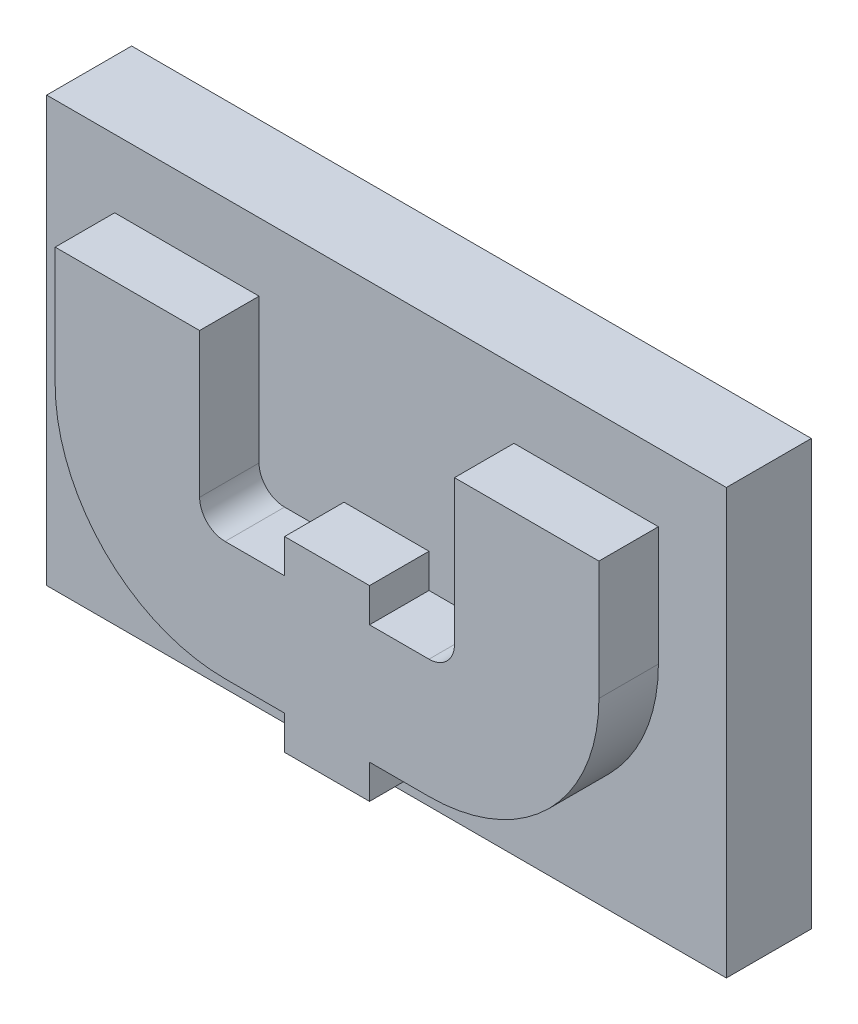
ISO-10303-21;
HEADER;
FILE_DESCRIPTION(('STEP AP214'),'2;1');
FILE_NAME('part.step','',(''),(''),'','','');
FILE_SCHEMA(('AUTOMOTIVE_DESIGN { 1 0 10303 214 1 1 1 1 }'));
ENDSEC;
DATA;
#1=APPLICATION_CONTEXT('core data for automotive mechanical design processes');
#2=APPLICATION_PROTOCOL_DEFINITION('international standard','automotive_design',2000,#1);
#3=PRODUCT_CONTEXT('',#1,'mechanical');
#4=PRODUCT('Part','Part','',(#3));
#5=PRODUCT_RELATED_PRODUCT_CATEGORY('part','',(#4));
#6=PRODUCT_DEFINITION_FORMATION('','',#4);
#7=PRODUCT_DEFINITION_CONTEXT('part definition',#1,'design');
#8=PRODUCT_DEFINITION('design','',#6,#7);
#9=PRODUCT_DEFINITION_SHAPE('','',#8);
#10=(LENGTH_UNIT() NAMED_UNIT(*) SI_UNIT(.MILLI.,.METRE.));
#11=(NAMED_UNIT(*) PLANE_ANGLE_UNIT() SI_UNIT($,.RADIAN.));
#12=(NAMED_UNIT(*) SI_UNIT($,.STERADIAN.) SOLID_ANGLE_UNIT());
#13=UNCERTAINTY_MEASURE_WITH_UNIT(LENGTH_MEASURE(1.E-05),#10,'distance_accuracy_value','');
#14=(GEOMETRIC_REPRESENTATION_CONTEXT(3) GLOBAL_UNCERTAINTY_ASSIGNED_CONTEXT((#13)) GLOBAL_UNIT_ASSIGNED_CONTEXT((#10,
#11,#12)) REPRESENTATION_CONTEXT('',''));
#15=CARTESIAN_POINT('',(0.,0.,0.));
#16=DIRECTION('',(0.,0.,1.));
#17=DIRECTION('',(1.,0.,0.));
#18=AXIS2_PLACEMENT_3D('',#15,#16,#17);
#19=CARTESIAN_POINT('',(0.,0.,10.));
#20=DIRECTION('',(0.,0.,-1.));
#21=DIRECTION('',(-1.,0.,0.));
#22=AXIS2_PLACEMENT_3D('',#19,#20,#21);
#23=PLANE('',#22);
#24=DIRECTION('',(0.,-1.,0.));
#25=VECTOR('',#24,1.);
#26=CARTESIAN_POINT('',(0.,0.,10.));
#27=LINE('',#26,#25);
#28=CARTESIAN_POINT('',(0.,50.,10.));
#29=VERTEX_POINT('',#28);
#30=CARTESIAN_POINT('',(0.,0.,10.));
#31=VERTEX_POINT('',#30);
#32=EDGE_CURVE('E342',#29,#31,#27,.T.);
#33=ORIENTED_EDGE('',*,*,#32,.T.);
#34=DIRECTION('',(1.,0.,0.));
#35=VECTOR('',#34,1.);
#36=CARTESIAN_POINT('',(0.,0.,10.));
#37=LINE('',#36,#35);
#38=CARTESIAN_POINT('',(80.,0.,10.));
#39=VERTEX_POINT('',#38);
#40=EDGE_CURVE('E346',#31,#39,#37,.T.);
#41=ORIENTED_EDGE('',*,*,#40,.T.);
#42=DIRECTION('',(0.,1.,0.));
#43=VECTOR('',#42,1.);
#44=CARTESIAN_POINT('',(80.,0.,10.));
#45=LINE('',#44,#43);
#46=CARTESIAN_POINT('',(80.,50.,10.));
#47=VERTEX_POINT('',#46);
#48=EDGE_CURVE('E350',#39,#47,#45,.T.);
#49=ORIENTED_EDGE('',*,*,#48,.T.);
#50=DIRECTION('',(-1.,0.,0.));
#51=VECTOR('',#50,1.);
#52=CARTESIAN_POINT('',(0.,50.,10.));
#53=LINE('',#52,#51);
#54=EDGE_CURVE('E353',#47,#29,#53,.T.);
#55=ORIENTED_EDGE('',*,*,#54,.T.);
#56=EDGE_LOOP('',(#33,#41,#49,#55));
#57=FACE_BOUND('',#56,.T.);
#58=DIRECTION('',(0.,-1.,0.));
#59=VECTOR('',#58,1.);
#60=CARTESIAN_POINT('',(35.,26.,10.));
#61=LINE('',#60,#59);
#62=CARTESIAN_POINT('',(35.,26.,10.));
#63=VERTEX_POINT('',#62);
#64=CARTESIAN_POINT('',(35.,22.,10.));
#65=VERTEX_POINT('',#64);
#66=EDGE_CURVE('E61',#63,#65,#61,.T.);
#67=ORIENTED_EDGE('',*,*,#66,.F.);
#68=DIRECTION('',(-1.,0.,0.));
#69=VECTOR('',#68,1.);
#70=CARTESIAN_POINT('',(35.,26.,10.));
#71=LINE('',#70,#69);
#72=CARTESIAN_POINT('',(45.,26.,10.));
#73=VERTEX_POINT('',#72);
#74=EDGE_CURVE('E65',#73,#63,#71,.T.);
#75=ORIENTED_EDGE('',*,*,#74,.F.);
#76=DIRECTION('',(0.,-1.,0.));
#77=VECTOR('',#76,1.);
#78=CARTESIAN_POINT('',(45.,26.,10.));
#79=LINE('',#78,#77);
#80=CARTESIAN_POINT('',(45.,22.,10.));
#81=VERTEX_POINT('',#80);
#82=EDGE_CURVE('E239',#73,#81,#79,.T.);
#83=ORIENTED_EDGE('',*,*,#82,.T.);
#84=DIRECTION('',(1.,0.,0.));
#85=VECTOR('',#84,1.);
#86=CARTESIAN_POINT('',(25.,22.,10.));
#87=LINE('',#86,#85);
#88=CARTESIAN_POINT('',(52.,22.,10.));
#89=VERTEX_POINT('',#88);
#90=EDGE_CURVE('E246',#81,#89,#87,.T.);
#91=ORIENTED_EDGE('',*,*,#90,.T.);
#92=CARTESIAN_POINT('',(52.,25.,10.));
#93=DIRECTION('',(0.,0.,-1.));
#94=DIRECTION('',(-1.,0.,0.));
#95=AXIS2_PLACEMENT_3D('',#92,#93,#94);
#96=CIRCLE('',#95,3.);
#97=CARTESIAN_POINT('',(55.,25.,10.));
#98=VERTEX_POINT('',#97);
#99=EDGE_CURVE('E426',#89,#98,#96,.F.);
#100=ORIENTED_EDGE('',*,*,#99,.T.);
#101=DIRECTION('',(0.,1.,0.));
#102=VECTOR('',#101,1.);
#103=CARTESIAN_POINT('',(55.,42.,10.));
#104=LINE('',#103,#102);
#105=CARTESIAN_POINT('',(55.,42.,10.));
#106=VERTEX_POINT('',#105);
#107=EDGE_CURVE('E253',#98,#106,#104,.T.);
#108=ORIENTED_EDGE('',*,*,#107,.T.);
#109=DIRECTION('',(-1.,0.,0.));
#110=VECTOR('',#109,1.);
#111=CARTESIAN_POINT('',(8.,42.,10.));
#112=LINE('',#111,#110);
#113=CARTESIAN_POINT('',(72.,42.,10.));
#114=VERTEX_POINT('',#113);
#115=EDGE_CURVE('E305',#114,#106,#112,.T.);
#116=ORIENTED_EDGE('',*,*,#115,.F.);
#117=DIRECTION('',(0.,1.,0.));
#118=VECTOR('',#117,1.);
#119=CARTESIAN_POINT('',(72.,42.,10.));
#120=LINE('',#119,#118);
#121=CARTESIAN_POINT('',(72.,28.,10.));
#122=VERTEX_POINT('',#121);
#123=EDGE_CURVE('E327',#122,#114,#120,.T.);
#124=ORIENTED_EDGE('',*,*,#123,.F.);
#125=CARTESIAN_POINT('',(52.,28.,10.));
#126=DIRECTION('',(0.,0.,-1.));
#127=DIRECTION('',(-1.,0.,0.));
#128=AXIS2_PLACEMENT_3D('',#125,#126,#127);
#129=CIRCLE('',#128,20.);
#130=CARTESIAN_POINT('',(52.,8.,10.));
#131=VERTEX_POINT('',#130);
#132=EDGE_CURVE('E404',#122,#131,#129,.T.);
#133=ORIENTED_EDGE('',*,*,#132,.T.);
#134=DIRECTION('',(1.,0.,0.));
#135=VECTOR('',#134,1.);
#136=CARTESIAN_POINT('',(8.,8.,10.));
#137=LINE('',#136,#135);
#138=CARTESIAN_POINT('',(45.,8.,10.));
#139=VERTEX_POINT('',#138);
#140=EDGE_CURVE('E322',#139,#131,#137,.T.);
#141=ORIENTED_EDGE('',*,*,#140,.F.);
#142=DIRECTION('',(0.,1.,0.));
#143=VECTOR('',#142,1.);
#144=CARTESIAN_POINT('',(45.,4.,10.));
#145=LINE('',#144,#143);
#146=CARTESIAN_POINT('',(45.,4.,10.));
#147=VERTEX_POINT('',#146);
#148=EDGE_CURVE('E292',#147,#139,#145,.T.);
#149=ORIENTED_EDGE('',*,*,#148,.F.);
#150=DIRECTION('',(1.,0.,0.));
#151=VECTOR('',#150,1.);
#152=CARTESIAN_POINT('',(35.,4.,10.));
#153=LINE('',#152,#151);
#154=CARTESIAN_POINT('',(35.,4.,10.));
#155=VERTEX_POINT('',#154);
#156=EDGE_CURVE('E271',#155,#147,#153,.T.);
#157=ORIENTED_EDGE('',*,*,#156,.F.);
#158=DIRECTION('',(0.,1.,0.));
#159=VECTOR('',#158,1.);
#160=CARTESIAN_POINT('',(35.,4.,10.));
#161=LINE('',#160,#159);
#162=CARTESIAN_POINT('',(35.,8.,10.));
#163=VERTEX_POINT('',#162);
#164=EDGE_CURVE('E295',#155,#163,#161,.T.);
#165=ORIENTED_EDGE('',*,*,#164,.T.);
#166=CARTESIAN_POINT('',(28.,8.,10.));
#167=VERTEX_POINT('',#166);
#168=EDGE_CURVE('E323',#167,#163,#137,.T.);
#169=ORIENTED_EDGE('',*,*,#168,.F.);
#170=CARTESIAN_POINT('',(28.,28.,10.));
#171=DIRECTION('',(0.,0.,-1.));
#172=DIRECTION('',(-1.,0.,0.));
#173=AXIS2_PLACEMENT_3D('',#170,#171,#172);
#174=CIRCLE('',#173,20.);
#175=CARTESIAN_POINT('',(8.,28.,10.));
#176=VERTEX_POINT('',#175);
#177=EDGE_CURVE('E408',#167,#176,#174,.T.);
#178=ORIENTED_EDGE('',*,*,#177,.T.);
#179=DIRECTION('',(0.,-1.,0.));
#180=VECTOR('',#179,1.);
#181=CARTESIAN_POINT('',(8.,42.,10.));
#182=LINE('',#181,#180);
#183=CARTESIAN_POINT('',(8.,42.,10.));
#184=VERTEX_POINT('',#183);
#185=EDGE_CURVE('E299',#184,#176,#182,.T.);
#186=ORIENTED_EDGE('',*,*,#185,.F.);
#187=CARTESIAN_POINT('',(25.,42.,10.));
#188=VERTEX_POINT('',#187);
#189=EDGE_CURVE('E330',#188,#184,#112,.T.);
#190=ORIENTED_EDGE('',*,*,#189,.F.);
#191=DIRECTION('',(0.,-1.,0.));
#192=VECTOR('',#191,1.);
#193=CARTESIAN_POINT('',(25.,42.,10.));
#194=LINE('',#193,#192);
#195=CARTESIAN_POINT('',(25.,25.,10.));
#196=VERTEX_POINT('',#195);
#197=EDGE_CURVE('E254',#188,#196,#194,.T.);
#198=ORIENTED_EDGE('',*,*,#197,.T.);
#199=CARTESIAN_POINT('',(28.,25.,10.));
#200=DIRECTION('',(0.,0.,-1.));
#201=DIRECTION('',(-1.,0.,0.));
#202=AXIS2_PLACEMENT_3D('',#199,#200,#201);
#203=CIRCLE('',#202,3.);
#204=CARTESIAN_POINT('',(28.,22.,10.));
#205=VERTEX_POINT('',#204);
#206=EDGE_CURVE('E423',#196,#205,#203,.F.);
#207=ORIENTED_EDGE('',*,*,#206,.T.);
#208=EDGE_CURVE('E250',#205,#65,#87,.T.);
#209=ORIENTED_EDGE('',*,*,#208,.T.);
#210=EDGE_LOOP('',(#67,#75,#83,#91,#100,#108,#116,#124,#133,#141,#149,#157,#165,#169,#178,#186,
#190,#198,#207,#209));
#211=FACE_BOUND('',#210,.T.);
#212=ADVANCED_FACE('F45',(#57,#211),#23,.F.);
#213=CARTESIAN_POINT('',(25.,22.,-26.0555127546399));
#214=DIRECTION('',(0.,-1.,0.));
#215=DIRECTION('',(0.,0.,-1.));
#216=AXIS2_PLACEMENT_3D('',#213,#214,#215);
#217=PLANE('',#216);
#218=DIRECTION('',(0.,0.,1.));
#219=VECTOR('',#218,1.);
#220=CARTESIAN_POINT('',(35.,22.,17.));
#221=LINE('',#220,#219);
#222=CARTESIAN_POINT('',(35.,22.,17.));
#223=VERTEX_POINT('',#222);
#224=EDGE_CURVE('E230',#65,#223,#221,.T.);
#225=ORIENTED_EDGE('',*,*,#224,.F.);
#226=ORIENTED_EDGE('',*,*,#208,.F.);
#227=DIRECTION('',(0.,0.,1.));
#228=VECTOR('',#227,1.);
#229=CARTESIAN_POINT('',(28.,22.,17.));
#230=LINE('',#229,#228);
#231=CARTESIAN_POINT('',(28.,22.,17.));
#232=VERTEX_POINT('',#231);
#233=EDGE_CURVE('E415',#205,#232,#230,.T.);
#234=ORIENTED_EDGE('',*,*,#233,.T.);
#235=DIRECTION('',(1.,0.,0.));
#236=VECTOR('',#235,1.);
#237=CARTESIAN_POINT('',(25.,22.,17.));
#238=LINE('',#237,#236);
#239=EDGE_CURVE('E247',#232,#223,#238,.T.);
#240=ORIENTED_EDGE('',*,*,#239,.T.);
#241=EDGE_LOOP('',(#225,#226,#234,#240));
#242=FACE_BOUND('',#241,.T.);
#243=ADVANCED_FACE('F518',(#242),#217,.F.);
#244=DIRECTION('',(0.,0.,-1.));
#245=VECTOR('',#244,1.);
#246=CARTESIAN_POINT('',(45.,22.,17.));
#247=LINE('',#246,#245);
#248=CARTESIAN_POINT('',(45.,22.,17.));
#249=VERTEX_POINT('',#248);
#250=EDGE_CURVE('E227',#249,#81,#247,.T.);
#251=ORIENTED_EDGE('',*,*,#250,.F.);
#252=CARTESIAN_POINT('',(52.,22.,17.));
#253=VERTEX_POINT('',#252);
#254=EDGE_CURVE('E237',#249,#253,#238,.T.);
#255=ORIENTED_EDGE('',*,*,#254,.T.);
#256=DIRECTION('',(0.,0.,1.));
#257=VECTOR('',#256,1.);
#258=CARTESIAN_POINT('',(52.,22.,10.));
#259=LINE('',#258,#257);
#260=EDGE_CURVE('E419',#253,#89,#259,.F.);
#261=ORIENTED_EDGE('',*,*,#260,.T.);
#262=ORIENTED_EDGE('',*,*,#90,.F.);
#263=EDGE_LOOP('',(#251,#255,#261,#262));
#264=FACE_BOUND('',#263,.T.);
#265=ADVANCED_FACE('F439',(#264),#217,.F.);
#266=CARTESIAN_POINT('',(8.,42.,17.));
#267=DIRECTION('',(0.,-1.,0.));
#268=DIRECTION('',(0.,0.,-1.));
#269=AXIS2_PLACEMENT_3D('',#266,#267,#268);
#270=PLANE('',#269);
#271=ORIENTED_EDGE('',*,*,#115,.T.);
#272=DIRECTION('',(0.,0.,1.));
#273=VECTOR('',#272,1.);
#274=CARTESIAN_POINT('',(55.,42.,-26.0555127546399));
#275=LINE('',#274,#273);
#276=CARTESIAN_POINT('',(55.,42.,17.));
#277=VERTEX_POINT('',#276);
#278=EDGE_CURVE('E262',#106,#277,#275,.T.);
#279=ORIENTED_EDGE('',*,*,#278,.T.);
#280=DIRECTION('',(-1.,0.,0.));
#281=VECTOR('',#280,1.);
#282=CARTESIAN_POINT('',(8.,42.,17.));
#283=LINE('',#282,#281);
#284=CARTESIAN_POINT('',(72.,42.,17.));
#285=VERTEX_POINT('',#284);
#286=EDGE_CURVE('E314',#285,#277,#283,.T.);
#287=ORIENTED_EDGE('',*,*,#286,.F.);
#288=DIRECTION('',(0.,0.,-1.));
#289=VECTOR('',#288,1.);
#290=CARTESIAN_POINT('',(72.,42.,17.));
#291=LINE('',#290,#289);
#292=EDGE_CURVE('E337',#285,#114,#291,.T.);
#293=ORIENTED_EDGE('',*,*,#292,.T.);
#294=EDGE_LOOP('',(#271,#279,#287,#293));
#295=FACE_BOUND('',#294,.T.);
#296=ADVANCED_FACE('F502',(#295),#270,.F.);
#297=CARTESIAN_POINT('',(8.,8.,17.));
#298=DIRECTION('',(0.,1.,0.));
#299=DIRECTION('',(0.,0.,1.));
#300=AXIS2_PLACEMENT_3D('',#297,#298,#299);
#301=PLANE('',#300);
#302=DIRECTION('',(0.,0.,-1.));
#303=VECTOR('',#302,1.);
#304=CARTESIAN_POINT('',(35.,8.,17.));
#305=LINE('',#304,#303);
#306=CARTESIAN_POINT('',(35.,8.,17.));
#307=VERTEX_POINT('',#306);
#308=EDGE_CURVE('E258',#307,#163,#305,.T.);
#309=ORIENTED_EDGE('',*,*,#308,.F.);
#310=DIRECTION('',(1.,0.,0.));
#311=VECTOR('',#310,1.);
#312=CARTESIAN_POINT('',(8.,8.,17.));
#313=LINE('',#312,#311);
#314=CARTESIAN_POINT('',(28.,8.,17.));
#315=VERTEX_POINT('',#314);
#316=EDGE_CURVE('E306',#315,#307,#313,.T.);
#317=ORIENTED_EDGE('',*,*,#316,.F.);
#318=DIRECTION('',(0.,0.,-1.));
#319=VECTOR('',#318,1.);
#320=CARTESIAN_POINT('',(28.,8.,17.));
#321=LINE('',#320,#319);
#322=EDGE_CURVE('E387',#315,#167,#321,.T.);
#323=ORIENTED_EDGE('',*,*,#322,.T.);
#324=ORIENTED_EDGE('',*,*,#168,.T.);
#325=EDGE_LOOP('',(#309,#317,#323,#324));
#326=FACE_BOUND('',#325,.T.);
#327=ADVANCED_FACE('F467',(#326),#301,.F.);
#328=DIRECTION('',(0.,0.,1.));
#329=VECTOR('',#328,1.);
#330=CARTESIAN_POINT('',(45.,8.,17.));
#331=LINE('',#330,#329);
#332=CARTESIAN_POINT('',(45.,8.,17.));
#333=VERTEX_POINT('',#332);
#334=EDGE_CURVE('E272',#139,#333,#331,.T.);
#335=ORIENTED_EDGE('',*,*,#334,.F.);
#336=ORIENTED_EDGE('',*,*,#140,.T.);
#337=DIRECTION('',(0.,0.,-1.));
#338=VECTOR('',#337,1.);
#339=CARTESIAN_POINT('',(52.,8.,17.));
#340=LINE('',#339,#338);
#341=CARTESIAN_POINT('',(52.,8.,17.));
#342=VERTEX_POINT('',#341);
#343=EDGE_CURVE('E391',#131,#342,#340,.F.);
#344=ORIENTED_EDGE('',*,*,#343,.T.);
#345=EDGE_CURVE('E304',#333,#342,#313,.T.);
#346=ORIENTED_EDGE('',*,*,#345,.F.);
#347=EDGE_LOOP('',(#335,#336,#344,#346));
#348=FACE_BOUND('',#347,.T.);
#349=ADVANCED_FACE('F489',(#348),#301,.F.);
#350=CARTESIAN_POINT('',(0.,0.,10.));
#351=DIRECTION('',(1.,0.,0.));
#352=DIRECTION('',(0.,0.,-1.));
#353=AXIS2_PLACEMENT_3D('',#350,#351,#352);
#354=PLANE('',#353);
#355=DIRECTION('',(0.,-1.,0.));
#356=VECTOR('',#355,1.);
#357=CARTESIAN_POINT('',(0.,0.,0.));
#358=LINE('',#357,#356);
#359=CARTESIAN_POINT('',(0.,50.,0.));
#360=VERTEX_POINT('',#359);
#361=CARTESIAN_POINT('',(0.,0.,0.));
#362=VERTEX_POINT('',#361);
#363=EDGE_CURVE('E341',#360,#362,#358,.T.);
#364=ORIENTED_EDGE('',*,*,#363,.T.);
#365=DIRECTION('',(0.,0.,-1.));
#366=VECTOR('',#365,1.);
#367=CARTESIAN_POINT('',(0.,0.,10.));
#368=LINE('',#367,#366);
#369=EDGE_CURVE('E379',#31,#362,#368,.T.);
#370=ORIENTED_EDGE('',*,*,#369,.F.);
#371=ORIENTED_EDGE('',*,*,#32,.F.);
#372=DIRECTION('',(0.,0.,-1.));
#373=VECTOR('',#372,1.);
#374=CARTESIAN_POINT('',(0.,50.,10.));
#375=LINE('',#374,#373);
#376=EDGE_CURVE('E356',#29,#360,#375,.T.);
#377=ORIENTED_EDGE('',*,*,#376,.T.);
#378=EDGE_LOOP('',(#364,#370,#371,#377));
#379=FACE_BOUND('',#378,.T.);
#380=ADVANCED_FACE('F544',(#379),#354,.F.);
#381=CARTESIAN_POINT('',(0.,0.,10.));
#382=DIRECTION('',(0.,1.,0.));
#383=DIRECTION('',(0.,0.,1.));
#384=AXIS2_PLACEMENT_3D('',#381,#382,#383);
#385=PLANE('',#384);
#386=DIRECTION('',(1.,0.,0.));
#387=VECTOR('',#386,1.);
#388=CARTESIAN_POINT('',(0.,0.,0.));
#389=LINE('',#388,#387);
#390=CARTESIAN_POINT('',(80.,0.,0.));
#391=VERTEX_POINT('',#390);
#392=EDGE_CURVE('E360',#362,#391,#389,.T.);
#393=ORIENTED_EDGE('',*,*,#392,.T.);
#394=DIRECTION('',(0.,0.,-1.));
#395=VECTOR('',#394,1.);
#396=CARTESIAN_POINT('',(80.,0.,10.));
#397=LINE('',#396,#395);
#398=EDGE_CURVE('E375',#39,#391,#397,.T.);
#399=ORIENTED_EDGE('',*,*,#398,.F.);
#400=ORIENTED_EDGE('',*,*,#40,.F.);
#401=ORIENTED_EDGE('',*,*,#369,.T.);
#402=EDGE_LOOP('',(#393,#399,#400,#401));
#403=FACE_BOUND('',#402,.T.);
#404=ADVANCED_FACE('F540',(#403),#385,.F.);
#405=CARTESIAN_POINT('',(80.,0.,10.));
#406=DIRECTION('',(-1.,0.,0.));
#407=DIRECTION('',(0.,0.,1.));
#408=AXIS2_PLACEMENT_3D('',#405,#406,#407);
#409=PLANE('',#408);
#410=DIRECTION('',(0.,1.,0.));
#411=VECTOR('',#410,1.);
#412=CARTESIAN_POINT('',(80.,0.,0.));
#413=LINE('',#412,#411);
#414=CARTESIAN_POINT('',(80.,50.,0.));
#415=VERTEX_POINT('',#414);
#416=EDGE_CURVE('E363',#391,#415,#413,.T.);
#417=ORIENTED_EDGE('',*,*,#416,.T.);
#418=DIRECTION('',(0.,0.,-1.));
#419=VECTOR('',#418,1.);
#420=CARTESIAN_POINT('',(80.,50.,10.));
#421=LINE('',#420,#419);
#422=EDGE_CURVE('E371',#47,#415,#421,.T.);
#423=ORIENTED_EDGE('',*,*,#422,.F.);
#424=ORIENTED_EDGE('',*,*,#48,.F.);
#425=ORIENTED_EDGE('',*,*,#398,.T.);
#426=EDGE_LOOP('',(#417,#423,#424,#425));
#427=FACE_BOUND('',#426,.T.);
#428=ADVANCED_FACE('F536',(#427),#409,.F.);
#429=CARTESIAN_POINT('',(0.,50.,10.));
#430=DIRECTION('',(0.,-1.,0.));
#431=DIRECTION('',(0.,0.,-1.));
#432=AXIS2_PLACEMENT_3D('',#429,#430,#431);
#433=PLANE('',#432);
#434=DIRECTION('',(-1.,0.,0.));
#435=VECTOR('',#434,1.);
#436=CARTESIAN_POINT('',(0.,50.,0.));
#437=LINE('',#436,#435);
#438=EDGE_CURVE('E347',#415,#360,#437,.T.);
#439=ORIENTED_EDGE('',*,*,#438,.T.);
#440=ORIENTED_EDGE('',*,*,#376,.F.);
#441=ORIENTED_EDGE('',*,*,#54,.F.);
#442=ORIENTED_EDGE('',*,*,#422,.T.);
#443=EDGE_LOOP('',(#439,#440,#441,#442));
#444=FACE_BOUND('',#443,.T.);
#445=ADVANCED_FACE('F532',(#444),#433,.F.);
#446=CARTESIAN_POINT('',(0.,0.,0.));
#447=DIRECTION('',(0.,0.,-1.));
#448=DIRECTION('',(-1.,0.,0.));
#449=AXIS2_PLACEMENT_3D('',#446,#447,#448);
#450=PLANE('',#449);
#451=ORIENTED_EDGE('',*,*,#363,.F.);
#452=ORIENTED_EDGE('',*,*,#438,.F.);
#453=ORIENTED_EDGE('',*,*,#416,.F.);
#454=ORIENTED_EDGE('',*,*,#392,.F.);
#455=EDGE_LOOP('',(#451,#452,#453,#454));
#456=FACE_BOUND('',#455,.T.);
#457=ADVANCED_FACE('F529',(#456),#450,.T.);
#458=CARTESIAN_POINT('',(8.,42.,17.));
#459=DIRECTION('',(1.,0.,0.));
#460=DIRECTION('',(0.,1.,0.));
#461=AXIS2_PLACEMENT_3D('',#458,#459,#460);
#462=PLANE('',#461);
#463=ORIENTED_EDGE('',*,*,#185,.T.);
#464=DIRECTION('',(0.,0.,-1.));
#465=VECTOR('',#464,1.);
#466=CARTESIAN_POINT('',(8.,28.,17.));
#467=LINE('',#466,#465);
#468=CARTESIAN_POINT('',(8.,28.,17.));
#469=VERTEX_POINT('',#468);
#470=EDGE_CURVE('E401',#176,#469,#467,.F.);
#471=ORIENTED_EDGE('',*,*,#470,.T.);
#472=DIRECTION('',(0.,-1.,0.));
#473=VECTOR('',#472,1.);
#474=CARTESIAN_POINT('',(8.,42.,17.));
#475=LINE('',#474,#473);
#476=CARTESIAN_POINT('',(8.,42.,17.));
#477=VERTEX_POINT('',#476);
#478=EDGE_CURVE('E300',#477,#469,#475,.T.);
#479=ORIENTED_EDGE('',*,*,#478,.F.);
#480=DIRECTION('',(0.,0.,-1.));
#481=VECTOR('',#480,1.);
#482=CARTESIAN_POINT('',(8.,42.,17.));
#483=LINE('',#482,#481);
#484=EDGE_CURVE('E318',#477,#184,#483,.T.);
#485=ORIENTED_EDGE('',*,*,#484,.T.);
#486=EDGE_LOOP('',(#463,#471,#479,#485));
#487=FACE_BOUND('',#486,.T.);
#488=ADVANCED_FACE('F458',(#487),#462,.F.);
#489=CARTESIAN_POINT('',(72.,42.,17.));
#490=DIRECTION('',(-1.,0.,0.));
#491=DIRECTION('',(0.,0.,1.));
#492=AXIS2_PLACEMENT_3D('',#489,#490,#491);
#493=PLANE('',#492);
#494=DIRECTION('',(0.,1.,0.));
#495=VECTOR('',#494,1.);
#496=CARTESIAN_POINT('',(72.,42.,17.));
#497=LINE('',#496,#495);
#498=CARTESIAN_POINT('',(72.,28.,17.));
#499=VERTEX_POINT('',#498);
#500=EDGE_CURVE('E310',#499,#285,#497,.T.);
#501=ORIENTED_EDGE('',*,*,#500,.F.);
#502=DIRECTION('',(0.,0.,-1.));
#503=VECTOR('',#502,1.);
#504=CARTESIAN_POINT('',(72.,28.,17.));
#505=LINE('',#504,#503);
#506=EDGE_CURVE('E383',#499,#122,#505,.T.);
#507=ORIENTED_EDGE('',*,*,#506,.T.);
#508=ORIENTED_EDGE('',*,*,#123,.T.);
#509=ORIENTED_EDGE('',*,*,#292,.F.);
#510=EDGE_LOOP('',(#501,#507,#508,#509));
#511=FACE_BOUND('',#510,.T.);
#512=ADVANCED_FACE('F495',(#511),#493,.F.);
#513=CARTESIAN_POINT('',(25.,42.,17.));
#514=VERTEX_POINT('',#513);
#515=EDGE_CURVE('E313',#514,#477,#283,.T.);
#516=ORIENTED_EDGE('',*,*,#515,.F.);
#517=DIRECTION('',(0.,0.,1.));
#518=VECTOR('',#517,1.);
#519=CARTESIAN_POINT('',(25.,42.,-26.0555127546399));
#520=LINE('',#519,#518);
#521=EDGE_CURVE('E259',#188,#514,#520,.T.);
#522=ORIENTED_EDGE('',*,*,#521,.F.);
#523=ORIENTED_EDGE('',*,*,#189,.T.);
#524=ORIENTED_EDGE('',*,*,#484,.F.);
#525=EDGE_LOOP('',(#516,#522,#523,#524));
#526=FACE_BOUND('',#525,.T.);
#527=ADVANCED_FACE('F454',(#526),#270,.F.);
#528=CARTESIAN_POINT('',(0.,0.,17.));
#529=DIRECTION('',(0.,0.,1.));
#530=DIRECTION('',(1.,0.,0.));
#531=AXIS2_PLACEMENT_3D('',#528,#529,#530);
#532=PLANE('',#531);
#533=DIRECTION('',(0.,1.,0.));
#534=VECTOR('',#533,1.);
#535=CARTESIAN_POINT('',(55.,42.,17.));
#536=LINE('',#535,#534);
#537=CARTESIAN_POINT('',(55.,25.,17.));
#538=VERTEX_POINT('',#537);
#539=EDGE_CURVE('E243',#538,#277,#536,.T.);
#540=ORIENTED_EDGE('',*,*,#539,.F.);
#541=CARTESIAN_POINT('',(52.,25.,17.));
#542=DIRECTION('',(0.,0.,1.));
#543=DIRECTION('',(1.,0.,0.));
#544=AXIS2_PLACEMENT_3D('',#541,#542,#543);
#545=CIRCLE('',#544,3.);
#546=EDGE_CURVE('E54',#538,#253,#545,.F.);
#547=ORIENTED_EDGE('',*,*,#546,.T.);
#548=ORIENTED_EDGE('',*,*,#254,.F.);
#549=DIRECTION('',(0.,-1.,0.));
#550=VECTOR('',#549,1.);
#551=CARTESIAN_POINT('',(45.,26.,17.));
#552=LINE('',#551,#550);
#553=CARTESIAN_POINT('',(45.,26.,17.));
#554=VERTEX_POINT('',#553);
#555=EDGE_CURVE('E216',#554,#249,#552,.T.);
#556=ORIENTED_EDGE('',*,*,#555,.F.);
#557=DIRECTION('',(1.,0.,0.));
#558=VECTOR('',#557,1.);
#559=CARTESIAN_POINT('',(35.,26.,17.));
#560=LINE('',#559,#558);
#561=CARTESIAN_POINT('',(35.,26.,17.));
#562=VERTEX_POINT('',#561);
#563=EDGE_CURVE('E206',#562,#554,#560,.T.);
#564=ORIENTED_EDGE('',*,*,#563,.F.);
#565=DIRECTION('',(0.,-1.,0.));
#566=VECTOR('',#565,1.);
#567=CARTESIAN_POINT('',(35.,26.,17.));
#568=LINE('',#567,#566);
#569=EDGE_CURVE('E212',#562,#223,#568,.T.);
#570=ORIENTED_EDGE('',*,*,#569,.T.);
#571=ORIENTED_EDGE('',*,*,#239,.F.);
#572=CARTESIAN_POINT('',(28.,25.,17.));
#573=DIRECTION('',(0.,0.,1.));
#574=DIRECTION('',(1.,0.,0.));
#575=AXIS2_PLACEMENT_3D('',#572,#573,#574);
#576=CIRCLE('',#575,3.);
#577=CARTESIAN_POINT('',(25.,25.,17.));
#578=VERTEX_POINT('',#577);
#579=EDGE_CURVE('E11',#232,#578,#576,.F.);
#580=ORIENTED_EDGE('',*,*,#579,.T.);
#581=DIRECTION('',(0.,-1.,0.));
#582=VECTOR('',#581,1.);
#583=CARTESIAN_POINT('',(25.,42.,17.));
#584=LINE('',#583,#582);
#585=EDGE_CURVE('E232',#514,#578,#584,.T.);
#586=ORIENTED_EDGE('',*,*,#585,.F.);
#587=ORIENTED_EDGE('',*,*,#515,.T.);
#588=ORIENTED_EDGE('',*,*,#478,.T.);
#589=CARTESIAN_POINT('',(28.,28.,17.));
#590=DIRECTION('',(0.,0.,1.));
#591=DIRECTION('',(1.,0.,0.));
#592=AXIS2_PLACEMENT_3D('',#589,#590,#591);
#593=CIRCLE('',#592,20.);
#594=EDGE_CURVE('E395',#469,#315,#593,.T.);
#595=ORIENTED_EDGE('',*,*,#594,.T.);
#596=ORIENTED_EDGE('',*,*,#316,.T.);
#597=DIRECTION('',(0.,1.,0.));
#598=VECTOR('',#597,1.);
#599=CARTESIAN_POINT('',(35.,4.,17.));
#600=LINE('',#599,#598);
#601=CARTESIAN_POINT('',(35.,4.,17.));
#602=VERTEX_POINT('',#601);
#603=EDGE_CURVE('E281',#602,#307,#600,.T.);
#604=ORIENTED_EDGE('',*,*,#603,.F.);
#605=DIRECTION('',(-1.,0.,0.));
#606=VECTOR('',#605,1.);
#607=CARTESIAN_POINT('',(35.,4.,17.));
#608=LINE('',#607,#606);
#609=CARTESIAN_POINT('',(45.,4.,17.));
#610=VERTEX_POINT('',#609);
#611=EDGE_CURVE('E278',#610,#602,#608,.T.);
#612=ORIENTED_EDGE('',*,*,#611,.F.);
#613=DIRECTION('',(0.,1.,0.));
#614=VECTOR('',#613,1.);
#615=CARTESIAN_POINT('',(45.,4.,17.));
#616=LINE('',#615,#614);
#617=EDGE_CURVE('E289',#610,#333,#616,.T.);
#618=ORIENTED_EDGE('',*,*,#617,.T.);
#619=ORIENTED_EDGE('',*,*,#345,.T.);
#620=CARTESIAN_POINT('',(52.,28.,17.));
#621=DIRECTION('',(0.,0.,1.));
#622=DIRECTION('',(1.,0.,0.));
#623=AXIS2_PLACEMENT_3D('',#620,#621,#622);
#624=CIRCLE('',#623,20.);
#625=EDGE_CURVE('E398',#342,#499,#624,.T.);
#626=ORIENTED_EDGE('',*,*,#625,.T.);
#627=ORIENTED_EDGE('',*,*,#500,.T.);
#628=ORIENTED_EDGE('',*,*,#286,.T.);
#629=EDGE_LOOP('',(#540,#547,#548,#556,#564,#570,#571,#580,#586,#587,#588,#595,#596,#604,#612,
#618,#619,#626,#627,#628));
#630=FACE_BOUND('',#629,.T.);
#631=ADVANCED_FACE('F209',(#630),#532,.T.);
#632=CARTESIAN_POINT('',(52.,28.,17.));
#633=DIRECTION('',(0.,0.,-1.));
#634=DIRECTION('',(-1.,0.,0.));
#635=AXIS2_PLACEMENT_3D('',#632,#633,#634);
#636=CYLINDRICAL_SURFACE('',#635,20.);
#637=ORIENTED_EDGE('',*,*,#625,.F.);
#638=ORIENTED_EDGE('',*,*,#343,.F.);
#639=ORIENTED_EDGE('',*,*,#132,.F.);
#640=ORIENTED_EDGE('',*,*,#506,.F.);
#641=EDGE_LOOP('',(#637,#638,#639,#640));
#642=FACE_BOUND('',#641,.T.);
#643=ADVANCED_FACE('F492',(#642),#636,.T.);
#644=CARTESIAN_POINT('',(28.,28.,17.));
#645=DIRECTION('',(0.,0.,-1.));
#646=DIRECTION('',(-1.,0.,0.));
#647=AXIS2_PLACEMENT_3D('',#644,#645,#646);
#648=CYLINDRICAL_SURFACE('',#647,20.);
#649=ORIENTED_EDGE('',*,*,#594,.F.);
#650=ORIENTED_EDGE('',*,*,#470,.F.);
#651=ORIENTED_EDGE('',*,*,#177,.F.);
#652=ORIENTED_EDGE('',*,*,#322,.F.);
#653=EDGE_LOOP('',(#649,#650,#651,#652));
#654=FACE_BOUND('',#653,.T.);
#655=ADVANCED_FACE('F461',(#654),#648,.T.);
#656=CARTESIAN_POINT('',(35.,4.,17.));
#657=DIRECTION('',(1.,0.,0.));
#658=DIRECTION('',(0.,0.,-1.));
#659=AXIS2_PLACEMENT_3D('',#656,#657,#658);
#660=PLANE('',#659);
#661=ORIENTED_EDGE('',*,*,#308,.T.);
#662=ORIENTED_EDGE('',*,*,#164,.F.);
#663=DIRECTION('',(0.,0.,-1.));
#664=VECTOR('',#663,1.);
#665=CARTESIAN_POINT('',(35.,4.,17.));
#666=LINE('',#665,#664);
#667=EDGE_CURVE('E268',#602,#155,#666,.T.);
#668=ORIENTED_EDGE('',*,*,#667,.F.);
#669=ORIENTED_EDGE('',*,*,#603,.T.);
#670=EDGE_LOOP('',(#661,#662,#668,#669));
#671=FACE_BOUND('',#670,.T.);
#672=ADVANCED_FACE('F471',(#671),#660,.F.);
#673=CARTESIAN_POINT('',(45.,4.,17.));
#674=DIRECTION('',(-1.,0.,0.));
#675=DIRECTION('',(0.,0.,1.));
#676=AXIS2_PLACEMENT_3D('',#673,#674,#675);
#677=PLANE('',#676);
#678=ORIENTED_EDGE('',*,*,#334,.T.);
#679=ORIENTED_EDGE('',*,*,#617,.F.);
#680=DIRECTION('',(0.,0.,1.));
#681=VECTOR('',#680,1.);
#682=CARTESIAN_POINT('',(45.,4.,17.));
#683=LINE('',#682,#681);
#684=EDGE_CURVE('E275',#147,#610,#683,.T.);
#685=ORIENTED_EDGE('',*,*,#684,.F.);
#686=ORIENTED_EDGE('',*,*,#148,.T.);
#687=EDGE_LOOP('',(#678,#679,#685,#686));
#688=FACE_BOUND('',#687,.T.);
#689=ADVANCED_FACE('F481',(#688),#677,.F.);
#690=CARTESIAN_POINT('',(0.,4.,0.));
#691=DIRECTION('',(0.,-1.,0.));
#692=DIRECTION('',(0.,0.,-1.));
#693=AXIS2_PLACEMENT_3D('',#690,#691,#692);
#694=PLANE('',#693);
#695=ORIENTED_EDGE('',*,*,#667,.T.);
#696=ORIENTED_EDGE('',*,*,#156,.T.);
#697=ORIENTED_EDGE('',*,*,#684,.T.);
#698=ORIENTED_EDGE('',*,*,#611,.T.);
#699=EDGE_LOOP('',(#695,#696,#697,#698));
#700=FACE_BOUND('',#699,.T.);
#701=ADVANCED_FACE('F478',(#700),#694,.T.);
#702=CARTESIAN_POINT('',(55.,42.,-26.0555127546399));
#703=DIRECTION('',(1.,0.,0.));
#704=DIRECTION('',(0.,0.,-1.));
#705=AXIS2_PLACEMENT_3D('',#702,#703,#704);
#706=PLANE('',#705);
#707=ORIENTED_EDGE('',*,*,#107,.F.);
#708=DIRECTION('',(0.,0.,1.));
#709=VECTOR('',#708,1.);
#710=CARTESIAN_POINT('',(55.,25.,17.));
#711=LINE('',#710,#709);
#712=EDGE_CURVE('E411',#98,#538,#711,.T.);
#713=ORIENTED_EDGE('',*,*,#712,.T.);
#714=ORIENTED_EDGE('',*,*,#539,.T.);
#715=ORIENTED_EDGE('',*,*,#278,.F.);
#716=EDGE_LOOP('',(#707,#713,#714,#715));
#717=FACE_BOUND('',#716,.T.);
#718=ADVANCED_FACE('F504',(#717),#706,.F.);
#719=CARTESIAN_POINT('',(25.,42.,-26.0555127546399));
#720=DIRECTION('',(-1.,0.,0.));
#721=DIRECTION('',(0.,-1.,0.));
#722=AXIS2_PLACEMENT_3D('',#719,#720,#721);
#723=PLANE('',#722);
#724=ORIENTED_EDGE('',*,*,#585,.T.);
#725=DIRECTION('',(0.,0.,1.));
#726=VECTOR('',#725,1.);
#727=CARTESIAN_POINT('',(25.,25.,10.));
#728=LINE('',#727,#726);
#729=EDGE_CURVE('E429',#578,#196,#728,.F.);
#730=ORIENTED_EDGE('',*,*,#729,.T.);
#731=ORIENTED_EDGE('',*,*,#197,.F.);
#732=ORIENTED_EDGE('',*,*,#521,.T.);
#733=EDGE_LOOP('',(#724,#730,#731,#732));
#734=FACE_BOUND('',#733,.T.);
#735=ADVANCED_FACE('F506',(#734),#723,.F.);
#736=CARTESIAN_POINT('',(52.,25.,-26.0555127546399));
#737=DIRECTION('',(0.,0.,-1.));
#738=DIRECTION('',(-1.,0.,0.));
#739=AXIS2_PLACEMENT_3D('',#736,#737,#738);
#740=CYLINDRICAL_SURFACE('',#739,3.);
#741=ORIENTED_EDGE('',*,*,#99,.F.);
#742=ORIENTED_EDGE('',*,*,#260,.F.);
#743=ORIENTED_EDGE('',*,*,#546,.F.);
#744=ORIENTED_EDGE('',*,*,#712,.F.);
#745=EDGE_LOOP('',(#741,#742,#743,#744));
#746=FACE_BOUND('',#745,.T.);
#747=ADVANCED_FACE('F437',(#746),#740,.F.);
#748=CARTESIAN_POINT('',(28.,25.,-26.0555127546399));
#749=DIRECTION('',(0.,0.,-1.));
#750=DIRECTION('',(-1.,0.,0.));
#751=AXIS2_PLACEMENT_3D('',#748,#749,#750);
#752=CYLINDRICAL_SURFACE('',#751,3.);
#753=ORIENTED_EDGE('',*,*,#206,.F.);
#754=ORIENTED_EDGE('',*,*,#729,.F.);
#755=ORIENTED_EDGE('',*,*,#579,.F.);
#756=ORIENTED_EDGE('',*,*,#233,.F.);
#757=EDGE_LOOP('',(#753,#754,#755,#756));
#758=FACE_BOUND('',#757,.T.);
#759=ADVANCED_FACE('F47',(#758),#752,.F.);
#760=CARTESIAN_POINT('',(35.,26.,17.));
#761=DIRECTION('',(1.,0.,0.));
#762=DIRECTION('',(0.,0.,-1.));
#763=AXIS2_PLACEMENT_3D('',#760,#761,#762);
#764=PLANE('',#763);
#765=ORIENTED_EDGE('',*,*,#224,.T.);
#766=ORIENTED_EDGE('',*,*,#569,.F.);
#767=DIRECTION('',(0.,0.,1.));
#768=VECTOR('',#767,1.);
#769=CARTESIAN_POINT('',(35.,26.,17.));
#770=LINE('',#769,#768);
#771=EDGE_CURVE('E221',#63,#562,#770,.T.);
#772=ORIENTED_EDGE('',*,*,#771,.F.);
#773=ORIENTED_EDGE('',*,*,#66,.T.);
#774=EDGE_LOOP('',(#765,#766,#772,#773));
#775=FACE_BOUND('',#774,.T.);
#776=ADVANCED_FACE('F229',(#775),#764,.F.);
#777=CARTESIAN_POINT('',(45.,26.,17.));
#778=DIRECTION('',(-1.,0.,0.));
#779=DIRECTION('',(0.,0.,1.));
#780=AXIS2_PLACEMENT_3D('',#777,#778,#779);
#781=PLANE('',#780);
#782=ORIENTED_EDGE('',*,*,#250,.T.);
#783=ORIENTED_EDGE('',*,*,#82,.F.);
#784=DIRECTION('',(0.,0.,-1.));
#785=VECTOR('',#784,1.);
#786=CARTESIAN_POINT('',(45.,26.,17.));
#787=LINE('',#786,#785);
#788=EDGE_CURVE('E220',#554,#73,#787,.T.);
#789=ORIENTED_EDGE('',*,*,#788,.F.);
#790=ORIENTED_EDGE('',*,*,#555,.T.);
#791=EDGE_LOOP('',(#782,#783,#789,#790));
#792=FACE_BOUND('',#791,.T.);
#793=ADVANCED_FACE('F559',(#792),#781,.F.);
#794=CARTESIAN_POINT('',(0.,26.,0.));
#795=DIRECTION('',(0.,-1.,0.));
#796=DIRECTION('',(0.,0.,-1.));
#797=AXIS2_PLACEMENT_3D('',#794,#795,#796);
#798=PLANE('',#797);
#799=ORIENTED_EDGE('',*,*,#771,.T.);
#800=ORIENTED_EDGE('',*,*,#563,.T.);
#801=ORIENTED_EDGE('',*,*,#788,.T.);
#802=ORIENTED_EDGE('',*,*,#74,.T.);
#803=EDGE_LOOP('',(#799,#800,#801,#802));
#804=FACE_BOUND('',#803,.T.);
#805=ADVANCED_FACE('F224',(#804),#798,.F.);
#806=CLOSED_SHELL('',(#212,#243,#265,#296,#327,#349,#380,#404,#428,#445,#457,#488,#512,#527,
#631,#643,#655,#672,#689,#701,#718,#735,#747,#759,#776,#793,#805));
#807=MANIFOLD_SOLID_BREP('B2',#806);
#808=ADVANCED_BREP_SHAPE_REPRESENTATION('',(#18,#807),#14);
#809=SHAPE_DEFINITION_REPRESENTATION(#9,#808);
ENDSEC;
END-ISO-10303-21;
